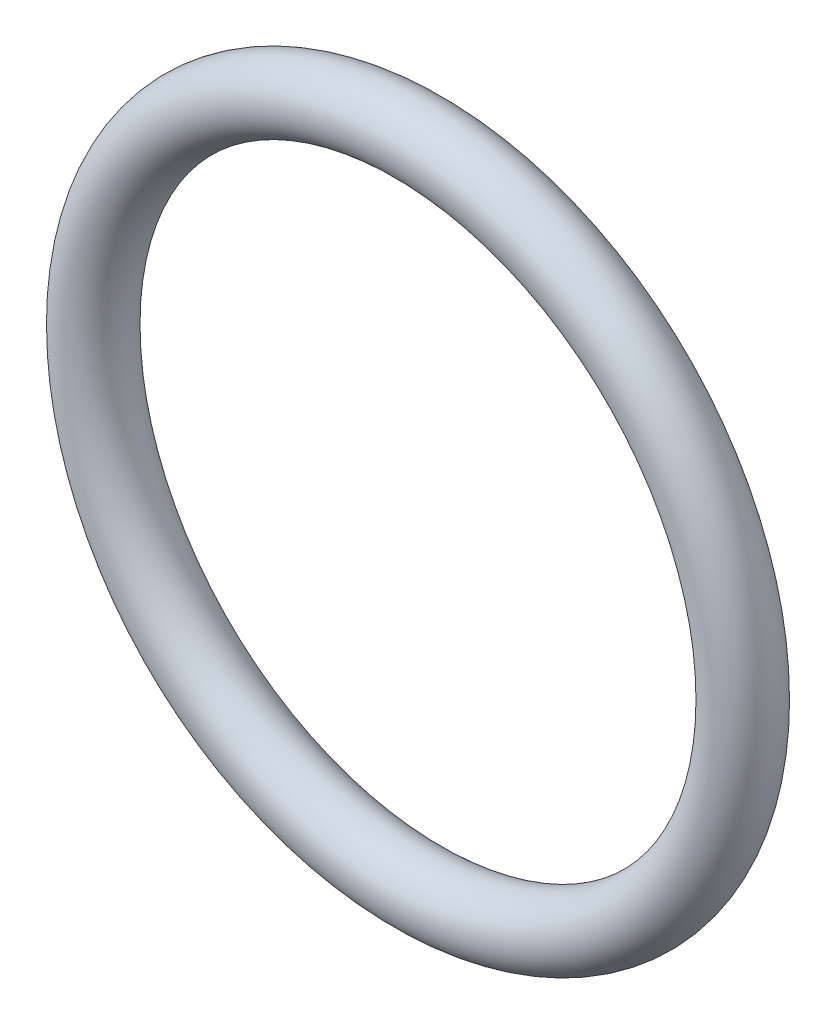
ISO-10303-21;
HEADER;
FILE_DESCRIPTION(('STEP AP214'),'2;1');
FILE_NAME('part.step','',(''),(''),'','','');
FILE_SCHEMA(('AUTOMOTIVE_DESIGN { 1 0 10303 214 1 1 1 1 }'));
ENDSEC;
DATA;
#1=APPLICATION_CONTEXT('core data for automotive mechanical design processes');
#2=APPLICATION_PROTOCOL_DEFINITION('international standard','automotive_design',2000,#1);
#3=PRODUCT_CONTEXT('',#1,'mechanical');
#4=PRODUCT('Part','Part','',(#3));
#5=PRODUCT_RELATED_PRODUCT_CATEGORY('part','',(#4));
#6=PRODUCT_DEFINITION_FORMATION('','',#4);
#7=PRODUCT_DEFINITION_CONTEXT('part definition',#1,'design');
#8=PRODUCT_DEFINITION('design','',#6,#7);
#9=PRODUCT_DEFINITION_SHAPE('','',#8);
#10=(LENGTH_UNIT() NAMED_UNIT(*) SI_UNIT(.MILLI.,.METRE.));
#11=(NAMED_UNIT(*) PLANE_ANGLE_UNIT() SI_UNIT($,.RADIAN.));
#12=(NAMED_UNIT(*) SI_UNIT($,.STERADIAN.) SOLID_ANGLE_UNIT());
#13=UNCERTAINTY_MEASURE_WITH_UNIT(LENGTH_MEASURE(1.E-05),#10,'distance_accuracy_value','');
#14=(GEOMETRIC_REPRESENTATION_CONTEXT(3) GLOBAL_UNCERTAINTY_ASSIGNED_CONTEXT((#13)) GLOBAL_UNIT_ASSIGNED_CONTEXT((#10,
#11,#12)) REPRESENTATION_CONTEXT('',''));
#15=CARTESIAN_POINT('',(0.,0.,0.));
#16=DIRECTION('',(0.,0.,1.));
#17=DIRECTION('',(1.,0.,0.));
#18=AXIS2_PLACEMENT_3D('',#15,#16,#17);
#19=CARTESIAN_POINT('',(0.,0.,0.));
#20=DIRECTION('',(0.,0.,1.));
#21=DIRECTION('',(1.,0.,0.));
#22=AXIS2_PLACEMENT_3D('',#19,#20,#21);
#23=TOROIDAL_SURFACE('',#22,7.85,0.8);
#24=CARTESIAN_POINT('',(8.65,0.,0.));
#25=VERTEX_POINT('',#24);
#26=VERTEX_LOOP('',#25);
#27=FACE_BOUND('',#26,.T.);
#28=ADVANCED_FACE('F27',(#27),#23,.T.);
#29=CLOSED_SHELL('',(#28));
#30=MANIFOLD_SOLID_BREP('B2',#29);
#31=ADVANCED_BREP_SHAPE_REPRESENTATION('',(#18,#30),#14);
#32=SHAPE_DEFINITION_REPRESENTATION(#9,#31);
ENDSEC;
END-ISO-10303-21;
